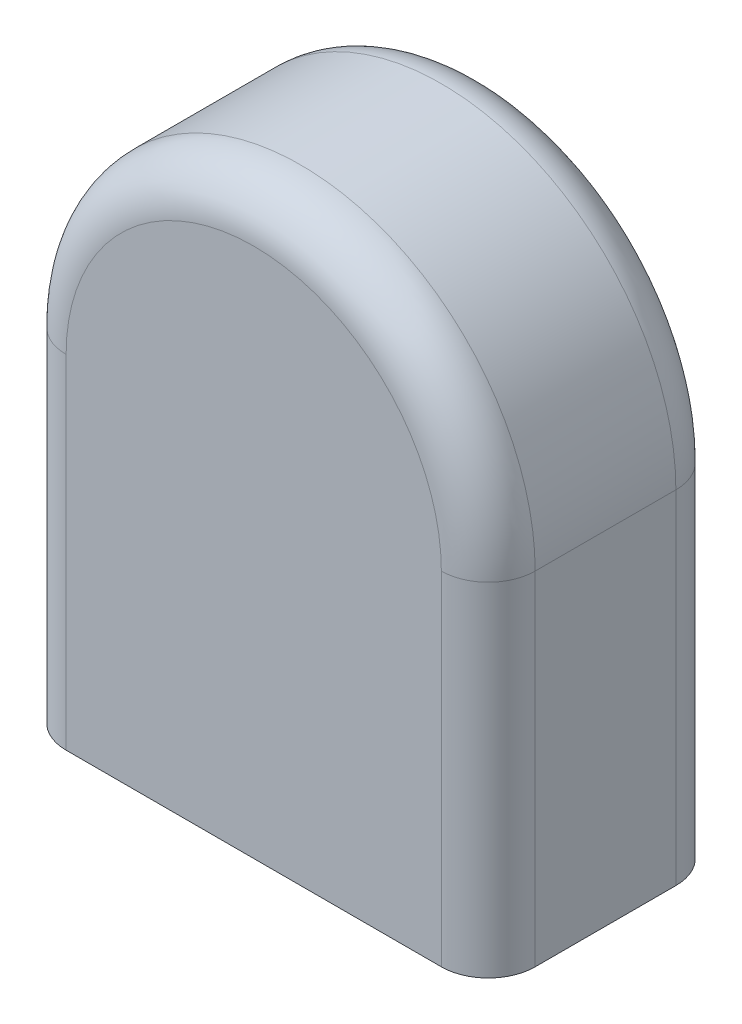
ISO-10303-21;
HEADER;
FILE_DESCRIPTION(('STEP AP214'),'2;1');
FILE_NAME('part.step','',(''),(''),'','','');
FILE_SCHEMA(('AUTOMOTIVE_DESIGN { 1 0 10303 214 1 1 1 1 }'));
ENDSEC;
DATA;
#1=APPLICATION_CONTEXT('core data for automotive mechanical design processes');
#2=APPLICATION_PROTOCOL_DEFINITION('international standard','automotive_design',2000,#1);
#3=PRODUCT_CONTEXT('',#1,'mechanical');
#4=PRODUCT('Part','Part','',(#3));
#5=PRODUCT_RELATED_PRODUCT_CATEGORY('part','',(#4));
#6=PRODUCT_DEFINITION_FORMATION('','',#4);
#7=PRODUCT_DEFINITION_CONTEXT('part definition',#1,'design');
#8=PRODUCT_DEFINITION('design','',#6,#7);
#9=PRODUCT_DEFINITION_SHAPE('','',#8);
#10=(LENGTH_UNIT() NAMED_UNIT(*) SI_UNIT(.MILLI.,.METRE.));
#11=(NAMED_UNIT(*) PLANE_ANGLE_UNIT() SI_UNIT($,.RADIAN.));
#12=(NAMED_UNIT(*) SI_UNIT($,.STERADIAN.) SOLID_ANGLE_UNIT());
#13=UNCERTAINTY_MEASURE_WITH_UNIT(LENGTH_MEASURE(1.E-05),#10,'distance_accuracy_value','');
#14=(GEOMETRIC_REPRESENTATION_CONTEXT(3) GLOBAL_UNCERTAINTY_ASSIGNED_CONTEXT((#13)) GLOBAL_UNIT_ASSIGNED_CONTEXT((#10,
#11,#12)) REPRESENTATION_CONTEXT('',''));
#15=CARTESIAN_POINT('',(0.,0.,0.));
#16=DIRECTION('',(0.,0.,1.));
#17=DIRECTION('',(1.,0.,0.));
#18=AXIS2_PLACEMENT_3D('',#15,#16,#17);
#19=CARTESIAN_POINT('',(-6.5,0.,3.25));
#20=DIRECTION('',(1.,0.,0.));
#21=DIRECTION('',(0.,1.,0.));
#22=AXIS2_PLACEMENT_3D('',#19,#20,#21);
#23=PLANE('',#22);
#24=DIRECTION('',(0.,0.,-1.));
#25=VECTOR('',#24,1.);
#26=CARTESIAN_POINT('',(-6.5,0.,3.25));
#27=LINE('',#26,#25);
#28=CARTESIAN_POINT('',(-6.5,0.,1.95));
#29=VERTEX_POINT('',#28);
#30=CARTESIAN_POINT('',(-6.5,0.,-1.95));
#31=VERTEX_POINT('',#30);
#32=EDGE_CURVE('E141',#29,#31,#27,.T.);
#33=ORIENTED_EDGE('',*,*,#32,.F.);
#34=DIRECTION('',(0.,-1.,0.));
#35=VECTOR('',#34,1.);
#36=CARTESIAN_POINT('',(-6.5,0.,1.95));
#37=LINE('',#36,#35);
#38=CARTESIAN_POINT('',(-6.5,9.5,1.95));
#39=VERTEX_POINT('',#38);
#40=EDGE_CURVE('E106',#29,#39,#37,.F.);
#41=ORIENTED_EDGE('',*,*,#40,.T.);
#42=DIRECTION('',(0.,0.,-1.));
#43=VECTOR('',#42,1.);
#44=CARTESIAN_POINT('',(-6.5,9.5,3.25));
#45=LINE('',#44,#43);
#46=CARTESIAN_POINT('',(-6.5,9.5,-1.95));
#47=VERTEX_POINT('',#46);
#48=EDGE_CURVE('E128',#39,#47,#45,.T.);
#49=ORIENTED_EDGE('',*,*,#48,.T.);
#50=DIRECTION('',(0.,-1.,0.));
#51=VECTOR('',#50,1.);
#52=CARTESIAN_POINT('',(-6.5,0.,-1.95));
#53=LINE('',#52,#51);
#54=EDGE_CURVE('E111',#47,#31,#53,.T.);
#55=ORIENTED_EDGE('',*,*,#54,.T.);
#56=EDGE_LOOP('',(#33,#41,#49,#55));
#57=FACE_BOUND('',#56,.T.);
#58=ADVANCED_FACE('F34',(#57),#23,.F.);
#59=CARTESIAN_POINT('',(-6.5,0.,3.25));
#60=DIRECTION('',(0.,1.,0.));
#61=DIRECTION('',(0.,0.,1.));
#62=AXIS2_PLACEMENT_3D('',#59,#60,#61);
#63=PLANE('',#62);
#64=DIRECTION('',(1.,0.,0.));
#65=VECTOR('',#64,1.);
#66=CARTESIAN_POINT('',(-6.5,0.,3.25));
#67=LINE('',#66,#65);
#68=CARTESIAN_POINT('',(-5.2,0.,3.25));
#69=VERTEX_POINT('',#68);
#70=CARTESIAN_POINT('',(5.2,0.,3.25));
#71=VERTEX_POINT('',#70);
#72=EDGE_CURVE('E117',#69,#71,#67,.T.);
#73=ORIENTED_EDGE('',*,*,#72,.F.);
#74=CARTESIAN_POINT('',(-5.2,0.,1.95));
#75=DIRECTION('',(0.,1.,0.));
#76=DIRECTION('',(0.,0.,1.));
#77=AXIS2_PLACEMENT_3D('',#74,#75,#76);
#78=CIRCLE('',#77,1.3);
#79=EDGE_CURVE('E101',#69,#29,#78,.F.);
#80=ORIENTED_EDGE('',*,*,#79,.T.);
#81=ORIENTED_EDGE('',*,*,#32,.T.);
#82=CARTESIAN_POINT('',(-5.2,0.,-1.95));
#83=DIRECTION('',(0.,1.,0.));
#84=DIRECTION('',(0.,0.,1.));
#85=AXIS2_PLACEMENT_3D('',#82,#83,#84);
#86=CIRCLE('',#85,1.3);
#87=CARTESIAN_POINT('',(-5.2,0.,-3.25));
#88=VERTEX_POINT('',#87);
#89=EDGE_CURVE('E112',#31,#88,#86,.F.);
#90=ORIENTED_EDGE('',*,*,#89,.T.);
#91=DIRECTION('',(1.,0.,0.));
#92=VECTOR('',#91,1.);
#93=CARTESIAN_POINT('',(-6.5,0.,-3.25));
#94=LINE('',#93,#92);
#95=CARTESIAN_POINT('',(5.2,0.,-3.25));
#96=VERTEX_POINT('',#95);
#97=EDGE_CURVE('E129',#88,#96,#94,.T.);
#98=ORIENTED_EDGE('',*,*,#97,.T.);
#99=CARTESIAN_POINT('',(5.2,0.,-1.95));
#100=DIRECTION('',(0.,1.,0.));
#101=DIRECTION('',(0.,0.,1.));
#102=AXIS2_PLACEMENT_3D('',#99,#100,#101);
#103=CIRCLE('',#102,1.3);
#104=CARTESIAN_POINT('',(6.5,0.,-1.95));
#105=VERTEX_POINT('',#104);
#106=EDGE_CURVE('E122',#96,#105,#103,.F.);
#107=ORIENTED_EDGE('',*,*,#106,.T.);
#108=DIRECTION('',(0.,0.,-1.));
#109=VECTOR('',#108,1.);
#110=CARTESIAN_POINT('',(6.5,0.,3.25));
#111=LINE('',#110,#109);
#112=CARTESIAN_POINT('',(6.5,0.,1.95));
#113=VERTEX_POINT('',#112);
#114=EDGE_CURVE('E139',#113,#105,#111,.T.);
#115=ORIENTED_EDGE('',*,*,#114,.F.);
#116=CARTESIAN_POINT('',(5.2,0.,1.95));
#117=DIRECTION('',(0.,1.,0.));
#118=DIRECTION('',(0.,0.,1.));
#119=AXIS2_PLACEMENT_3D('',#116,#117,#118);
#120=CIRCLE('',#119,1.3);
#121=EDGE_CURVE('E127',#113,#71,#120,.F.);
#122=ORIENTED_EDGE('',*,*,#121,.T.);
#123=EDGE_LOOP('',(#73,#80,#81,#90,#98,#107,#115,#122));
#124=FACE_BOUND('',#123,.T.);
#125=ADVANCED_FACE('F124',(#124),#63,.F.);
#126=CARTESIAN_POINT('',(6.5,0.,3.25));
#127=DIRECTION('',(-1.,0.,0.));
#128=DIRECTION('',(0.,-1.,0.));
#129=AXIS2_PLACEMENT_3D('',#126,#127,#128);
#130=PLANE('',#129);
#131=DIRECTION('',(0.,0.,-1.));
#132=VECTOR('',#131,1.);
#133=CARTESIAN_POINT('',(6.5,9.5,3.25));
#134=LINE('',#133,#132);
#135=CARTESIAN_POINT('',(6.5,9.5,1.95));
#136=VERTEX_POINT('',#135);
#137=CARTESIAN_POINT('',(6.5,9.5,-1.95));
#138=VERTEX_POINT('',#137);
#139=EDGE_CURVE('E132',#136,#138,#134,.T.);
#140=ORIENTED_EDGE('',*,*,#139,.F.);
#141=DIRECTION('',(0.,1.,0.));
#142=VECTOR('',#141,1.);
#143=CARTESIAN_POINT('',(6.5,0.,1.95));
#144=LINE('',#143,#142);
#145=EDGE_CURVE('E162',#136,#113,#144,.F.);
#146=ORIENTED_EDGE('',*,*,#145,.T.);
#147=ORIENTED_EDGE('',*,*,#114,.T.);
#148=DIRECTION('',(0.,1.,0.));
#149=VECTOR('',#148,1.);
#150=CARTESIAN_POINT('',(6.5,9.5,-1.95));
#151=LINE('',#150,#149);
#152=EDGE_CURVE('E49',#105,#138,#151,.T.);
#153=ORIENTED_EDGE('',*,*,#152,.T.);
#154=EDGE_LOOP('',(#140,#146,#147,#153));
#155=FACE_BOUND('',#154,.T.);
#156=ADVANCED_FACE('F210',(#155),#130,.F.);
#157=CARTESIAN_POINT('',(0.,9.5,3.25));
#158=DIRECTION('',(0.,0.,-1.));
#159=DIRECTION('',(-1.,0.,0.));
#160=AXIS2_PLACEMENT_3D('',#157,#158,#159);
#161=CYLINDRICAL_SURFACE('',#160,6.5);
#162=ORIENTED_EDGE('',*,*,#48,.F.);
#163=CARTESIAN_POINT('',(0.,9.5,1.95));
#164=DIRECTION('',(0.,0.,-1.));
#165=DIRECTION('',(-1.,0.,0.));
#166=AXIS2_PLACEMENT_3D('',#163,#164,#165);
#167=CIRCLE('',#166,6.5);
#168=EDGE_CURVE('E56',#39,#136,#167,.T.);
#169=ORIENTED_EDGE('',*,*,#168,.T.);
#170=ORIENTED_EDGE('',*,*,#139,.T.);
#171=CARTESIAN_POINT('',(0.,9.5,-1.95));
#172=DIRECTION('',(0.,0.,-1.));
#173=DIRECTION('',(-1.,0.,0.));
#174=AXIS2_PLACEMENT_3D('',#171,#172,#173);
#175=CIRCLE('',#174,6.5);
#176=EDGE_CURVE('E158',#138,#47,#175,.F.);
#177=ORIENTED_EDGE('',*,*,#176,.T.);
#178=EDGE_LOOP('',(#162,#169,#170,#177));
#179=FACE_BOUND('',#178,.T.);
#180=ADVANCED_FACE('F237',(#179),#161,.T.);
#181=CARTESIAN_POINT('',(0.,9.5,3.25));
#182=DIRECTION('',(0.,0.,-1.));
#183=DIRECTION('',(-1.,0.,0.));
#184=AXIS2_PLACEMENT_3D('',#181,#182,#183);
#185=PLANE('',#184);
#186=CARTESIAN_POINT('',(0.,9.5,3.25));
#187=DIRECTION('',(0.,0.,-1.));
#188=DIRECTION('',(-1.,0.,0.));
#189=AXIS2_PLACEMENT_3D('',#186,#187,#188);
#190=CIRCLE('',#189,5.2);
#191=CARTESIAN_POINT('',(5.2,9.5,3.25));
#192=VERTEX_POINT('',#191);
#193=CARTESIAN_POINT('',(-5.2,9.5,3.25));
#194=VERTEX_POINT('',#193);
#195=EDGE_CURVE('E120',#192,#194,#190,.F.);
#196=ORIENTED_EDGE('',*,*,#195,.T.);
#197=DIRECTION('',(0.,-1.,0.));
#198=VECTOR('',#197,1.);
#199=CARTESIAN_POINT('',(-5.2,9.5,3.25));
#200=LINE('',#199,#198);
#201=EDGE_CURVE('E105',#194,#69,#200,.T.);
#202=ORIENTED_EDGE('',*,*,#201,.T.);
#203=ORIENTED_EDGE('',*,*,#72,.T.);
#204=DIRECTION('',(0.,1.,0.));
#205=VECTOR('',#204,1.);
#206=CARTESIAN_POINT('',(5.2,9.5,3.25));
#207=LINE('',#206,#205);
#208=EDGE_CURVE('E143',#71,#192,#207,.T.);
#209=ORIENTED_EDGE('',*,*,#208,.T.);
#210=EDGE_LOOP('',(#196,#202,#203,#209));
#211=FACE_BOUND('',#210,.T.);
#212=ADVANCED_FACE('F116',(#211),#185,.F.);
#213=CARTESIAN_POINT('',(0.,9.5,-3.25));
#214=DIRECTION('',(0.,0.,-1.));
#215=DIRECTION('',(-1.,0.,0.));
#216=AXIS2_PLACEMENT_3D('',#213,#214,#215);
#217=PLANE('',#216);
#218=CARTESIAN_POINT('',(0.,9.5,-3.25));
#219=DIRECTION('',(0.,0.,-1.));
#220=DIRECTION('',(-1.,0.,0.));
#221=AXIS2_PLACEMENT_3D('',#218,#219,#220);
#222=CIRCLE('',#221,3.85);
#223=CARTESIAN_POINT('',(-3.85,9.5,-3.25));
#224=VERTEX_POINT('',#223);
#225=EDGE_CURVE('E11',#224,#224,#222,.F.);
#226=ORIENTED_EDGE('',*,*,#225,.T.);
#227=EDGE_LOOP('',(#226));
#228=FACE_BOUND('',#227,.T.);
#229=ORIENTED_EDGE('',*,*,#97,.F.);
#230=DIRECTION('',(0.,-1.,0.));
#231=VECTOR('',#230,1.);
#232=CARTESIAN_POINT('',(-5.2,9.5,-3.25));
#233=LINE('',#232,#231);
#234=CARTESIAN_POINT('',(-5.2,9.5,-3.25));
#235=VERTEX_POINT('',#234);
#236=EDGE_CURVE('E156',#88,#235,#233,.F.);
#237=ORIENTED_EDGE('',*,*,#236,.T.);
#238=CARTESIAN_POINT('',(0.,9.5,-3.25));
#239=DIRECTION('',(0.,0.,-1.));
#240=DIRECTION('',(-1.,0.,0.));
#241=AXIS2_PLACEMENT_3D('',#238,#239,#240);
#242=CIRCLE('',#241,5.2);
#243=CARTESIAN_POINT('',(5.2,9.5,-3.25));
#244=VERTEX_POINT('',#243);
#245=EDGE_CURVE('E154',#235,#244,#242,.T.);
#246=ORIENTED_EDGE('',*,*,#245,.T.);
#247=DIRECTION('',(0.,1.,0.));
#248=VECTOR('',#247,1.);
#249=CARTESIAN_POINT('',(5.2,0.,-3.25));
#250=LINE('',#249,#248);
#251=EDGE_CURVE('E152',#244,#96,#250,.F.);
#252=ORIENTED_EDGE('',*,*,#251,.T.);
#253=EDGE_LOOP('',(#229,#237,#246,#252));
#254=FACE_BOUND('',#253,.T.);
#255=ADVANCED_FACE('F202',(#228,#254),#217,.T.);
#256=CARTESIAN_POINT('',(0.,9.5,-0.25));
#257=DIRECTION('',(0.,0.,-1.));
#258=DIRECTION('',(-1.,0.,0.));
#259=AXIS2_PLACEMENT_3D('',#256,#257,#258);
#260=CYLINDRICAL_SURFACE('',#259,3.25);
#261=CARTESIAN_POINT('',(0.,9.5,-0.85));
#262=DIRECTION('',(0.,0.,-1.));
#263=DIRECTION('',(-1.,0.,0.));
#264=AXIS2_PLACEMENT_3D('',#261,#262,#263);
#265=CIRCLE('',#264,3.25);
#266=CARTESIAN_POINT('',(-3.25,9.5,-0.85));
#267=VERTEX_POINT('',#266);
#268=EDGE_CURVE('E42',#267,#267,#265,.F.);
#269=ORIENTED_EDGE('',*,*,#268,.T.);
#270=EDGE_LOOP('',(#269));
#271=FACE_BOUND('',#270,.T.);
#272=CARTESIAN_POINT('',(0.,9.5,-2.65));
#273=DIRECTION('',(0.,0.,-1.));
#274=DIRECTION('',(-1.,0.,0.));
#275=AXIS2_PLACEMENT_3D('',#272,#273,#274);
#276=CIRCLE('',#275,3.25);
#277=CARTESIAN_POINT('',(-3.25,9.5,-2.65));
#278=VERTEX_POINT('',#277);
#279=EDGE_CURVE('E177',#278,#278,#276,.T.);
#280=ORIENTED_EDGE('',*,*,#279,.T.);
#281=EDGE_LOOP('',(#280));
#282=FACE_BOUND('',#281,.T.);
#283=ADVANCED_FACE('F182',(#271,#282),#260,.F.);
#284=CARTESIAN_POINT('',(0.,9.5,-0.25));
#285=DIRECTION('',(0.,0.,-1.));
#286=DIRECTION('',(-1.,0.,0.));
#287=AXIS2_PLACEMENT_3D('',#284,#285,#286);
#288=PLANE('',#287);
#289=CARTESIAN_POINT('',(0.,9.5,-0.25));
#290=DIRECTION('',(0.,0.,-1.));
#291=DIRECTION('',(-1.,0.,0.));
#292=AXIS2_PLACEMENT_3D('',#289,#290,#291);
#293=CIRCLE('',#292,2.65);
#294=CARTESIAN_POINT('',(-2.65,9.5,-0.25));
#295=VERTEX_POINT('',#294);
#296=EDGE_CURVE('E164',#295,#295,#293,.T.);
#297=ORIENTED_EDGE('',*,*,#296,.T.);
#298=EDGE_LOOP('',(#297));
#299=FACE_BOUND('',#298,.T.);
#300=ADVANCED_FACE('F191',(#299),#288,.T.);
#301=CARTESIAN_POINT('',(5.2,9.5,1.95));
#302=DIRECTION('',(0.,1.,0.));
#303=DIRECTION('',(-1.,0.,0.));
#304=AXIS2_PLACEMENT_3D('',#301,#302,#303);
#305=CYLINDRICAL_SURFACE('',#304,1.3);
#306=ORIENTED_EDGE('',*,*,#121,.F.);
#307=ORIENTED_EDGE('',*,*,#145,.F.);
#308=CARTESIAN_POINT('',(5.2,9.5,1.95));
#309=DIRECTION('',(0.,1.,0.));
#310=DIRECTION('',(0.,0.,1.));
#311=AXIS2_PLACEMENT_3D('',#308,#309,#310);
#312=CIRCLE('',#311,1.3);
#313=EDGE_CURVE('E135',#192,#136,#312,.T.);
#314=ORIENTED_EDGE('',*,*,#313,.F.);
#315=ORIENTED_EDGE('',*,*,#208,.F.);
#316=EDGE_LOOP('',(#306,#307,#314,#315));
#317=FACE_BOUND('',#316,.T.);
#318=ADVANCED_FACE('F193',(#317),#305,.T.);
#319=CARTESIAN_POINT('',(0.,9.5,1.95));
#320=DIRECTION('',(0.,0.,-1.));
#321=DIRECTION('',(-1.,0.,0.));
#322=AXIS2_PLACEMENT_3D('',#319,#320,#321);
#323=TOROIDAL_SURFACE('',#322,5.2,1.3);
#324=ORIENTED_EDGE('',*,*,#313,.T.);
#325=ORIENTED_EDGE('',*,*,#168,.F.);
#326=CARTESIAN_POINT('',(-5.2,9.5,1.95));
#327=DIRECTION('',(0.,-1.,0.));
#328=DIRECTION('',(0.,0.,-1.));
#329=AXIS2_PLACEMENT_3D('',#326,#327,#328);
#330=CIRCLE('',#329,1.3);
#331=EDGE_CURVE('E165',#194,#39,#330,.T.);
#332=ORIENTED_EDGE('',*,*,#331,.F.);
#333=ORIENTED_EDGE('',*,*,#195,.F.);
#334=EDGE_LOOP('',(#324,#325,#332,#333));
#335=FACE_BOUND('',#334,.T.);
#336=ADVANCED_FACE('F199',(#335),#323,.T.);
#337=CARTESIAN_POINT('',(-5.2,9.5,1.95));
#338=DIRECTION('',(0.,-1.,0.));
#339=DIRECTION('',(1.,0.,0.));
#340=AXIS2_PLACEMENT_3D('',#337,#338,#339);
#341=CYLINDRICAL_SURFACE('',#340,1.3);
#342=ORIENTED_EDGE('',*,*,#331,.T.);
#343=ORIENTED_EDGE('',*,*,#40,.F.);
#344=ORIENTED_EDGE('',*,*,#79,.F.);
#345=ORIENTED_EDGE('',*,*,#201,.F.);
#346=EDGE_LOOP('',(#342,#343,#344,#345));
#347=FACE_BOUND('',#346,.T.);
#348=ADVANCED_FACE('F104',(#347),#341,.T.);
#349=CARTESIAN_POINT('',(5.2,0.,-1.95));
#350=DIRECTION('',(0.,-1.,0.));
#351=DIRECTION('',(1.,0.,0.));
#352=AXIS2_PLACEMENT_3D('',#349,#350,#351);
#353=CYLINDRICAL_SURFACE('',#352,1.3);
#354=ORIENTED_EDGE('',*,*,#106,.F.);
#355=ORIENTED_EDGE('',*,*,#251,.F.);
#356=CARTESIAN_POINT('',(5.2,9.5,-1.95));
#357=DIRECTION('',(0.,1.,0.));
#358=DIRECTION('',(0.,0.,1.));
#359=AXIS2_PLACEMENT_3D('',#356,#357,#358);
#360=CIRCLE('',#359,1.3);
#361=EDGE_CURVE('E167',#138,#244,#360,.T.);
#362=ORIENTED_EDGE('',*,*,#361,.F.);
#363=ORIENTED_EDGE('',*,*,#152,.F.);
#364=EDGE_LOOP('',(#354,#355,#362,#363));
#365=FACE_BOUND('',#364,.T.);
#366=ADVANCED_FACE('F216',(#365),#353,.T.);
#367=CARTESIAN_POINT('',(0.,9.5,-1.95));
#368=DIRECTION('',(0.,0.,-1.));
#369=DIRECTION('',(-1.,0.,0.));
#370=AXIS2_PLACEMENT_3D('',#367,#368,#369);
#371=TOROIDAL_SURFACE('',#370,5.2,1.3);
#372=ORIENTED_EDGE('',*,*,#361,.T.);
#373=ORIENTED_EDGE('',*,*,#245,.F.);
#374=CARTESIAN_POINT('',(-5.2,9.5,-1.95));
#375=DIRECTION('',(0.,-1.,0.));
#376=DIRECTION('',(0.,0.,-1.));
#377=AXIS2_PLACEMENT_3D('',#374,#375,#376);
#378=CIRCLE('',#377,1.3);
#379=EDGE_CURVE('E170',#47,#235,#378,.T.);
#380=ORIENTED_EDGE('',*,*,#379,.F.);
#381=ORIENTED_EDGE('',*,*,#176,.F.);
#382=EDGE_LOOP('',(#372,#373,#380,#381));
#383=FACE_BOUND('',#382,.T.);
#384=ADVANCED_FACE('F222',(#383),#371,.T.);
#385=CARTESIAN_POINT('',(-5.2,0.,-1.95));
#386=DIRECTION('',(0.,1.,0.));
#387=DIRECTION('',(-1.,0.,0.));
#388=AXIS2_PLACEMENT_3D('',#385,#386,#387);
#389=CYLINDRICAL_SURFACE('',#388,1.3);
#390=ORIENTED_EDGE('',*,*,#379,.T.);
#391=ORIENTED_EDGE('',*,*,#236,.F.);
#392=ORIENTED_EDGE('',*,*,#89,.F.);
#393=ORIENTED_EDGE('',*,*,#54,.F.);
#394=EDGE_LOOP('',(#390,#391,#392,#393));
#395=FACE_BOUND('',#394,.T.);
#396=ADVANCED_FACE('F188',(#395),#389,.T.);
#397=CARTESIAN_POINT('',(0.,9.5,-0.85));
#398=DIRECTION('',(0.,0.,-1.));
#399=DIRECTION('',(-1.,0.,0.));
#400=AXIS2_PLACEMENT_3D('',#397,#398,#399);
#401=TOROIDAL_SURFACE('',#400,2.65,0.6);
#402=ORIENTED_EDGE('',*,*,#268,.F.);
#403=EDGE_LOOP('',(#402));
#404=FACE_BOUND('',#403,.T.);
#405=ORIENTED_EDGE('',*,*,#296,.F.);
#406=EDGE_LOOP('',(#405));
#407=FACE_BOUND('',#406,.T.);
#408=ADVANCED_FACE('F185',(#404,#407),#401,.F.);
#409=CARTESIAN_POINT('',(0.,9.5,-2.65));
#410=DIRECTION('',(0.,0.,-1.));
#411=DIRECTION('',(-1.,0.,0.));
#412=AXIS2_PLACEMENT_3D('',#409,#410,#411);
#413=TOROIDAL_SURFACE('',#412,3.85,0.6);
#414=ORIENTED_EDGE('',*,*,#225,.F.);
#415=EDGE_LOOP('',(#414));
#416=FACE_BOUND('',#415,.T.);
#417=ORIENTED_EDGE('',*,*,#279,.F.);
#418=EDGE_LOOP('',(#417));
#419=FACE_BOUND('',#418,.T.);
#420=ADVANCED_FACE('F36',(#416,#419),#413,.T.);
#421=CLOSED_SHELL('',(#58,#125,#156,#180,#212,#255,#283,#300,#318,#336,#348,#366,#384,#396,#408,#420));
#422=MANIFOLD_SOLID_BREP('B2',#421);
#423=ADVANCED_BREP_SHAPE_REPRESENTATION('',(#18,#422),#14);
#424=SHAPE_DEFINITION_REPRESENTATION(#9,#423);
ENDSEC;
END-ISO-10303-21;
